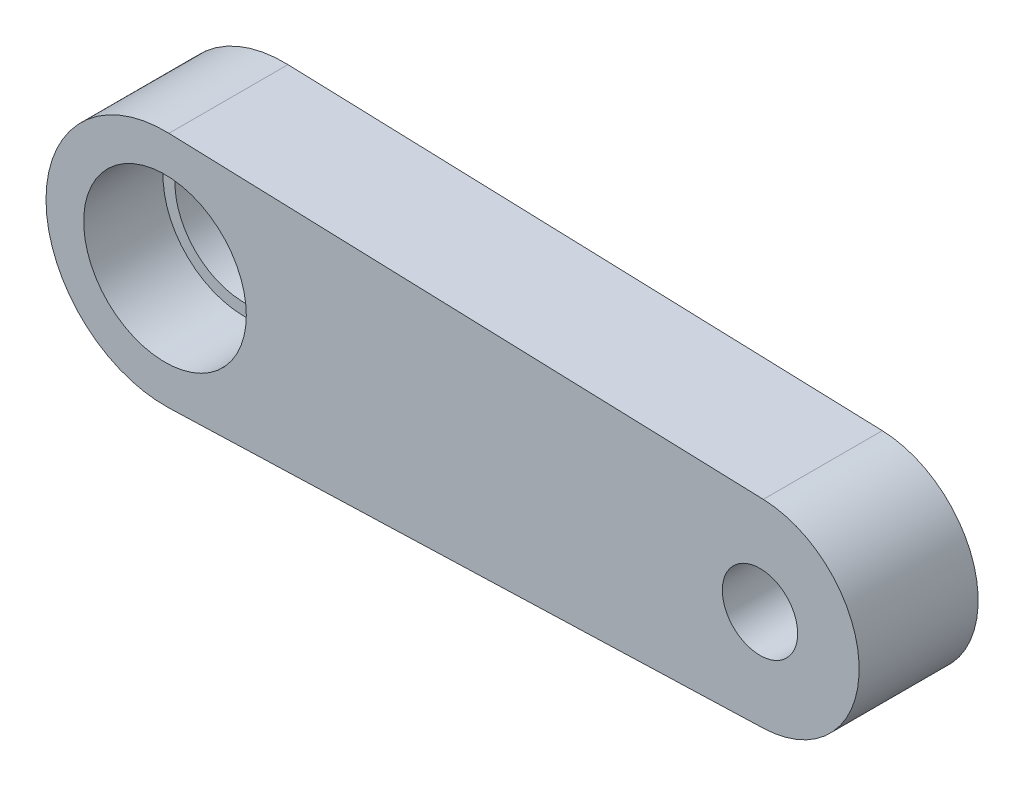
ISO-10303-21;
HEADER;
FILE_DESCRIPTION(('STEP AP214'),'2;1');
FILE_NAME('part.step','',(''),(''),'','','');
FILE_SCHEMA(('AUTOMOTIVE_DESIGN { 1 0 10303 214 1 1 1 1 }'));
ENDSEC;
DATA;
#1=APPLICATION_CONTEXT('core data for automotive mechanical design processes');
#2=APPLICATION_PROTOCOL_DEFINITION('international standard','automotive_design',2000,#1);
#3=PRODUCT_CONTEXT('',#1,'mechanical');
#4=PRODUCT('Part','Part','',(#3));
#5=PRODUCT_RELATED_PRODUCT_CATEGORY('part','',(#4));
#6=PRODUCT_DEFINITION_FORMATION('','',#4);
#7=PRODUCT_DEFINITION_CONTEXT('part definition',#1,'design');
#8=PRODUCT_DEFINITION('design','',#6,#7);
#9=PRODUCT_DEFINITION_SHAPE('','',#8);
#10=(LENGTH_UNIT() NAMED_UNIT(*) SI_UNIT(.MILLI.,.METRE.));
#11=(NAMED_UNIT(*) PLANE_ANGLE_UNIT() SI_UNIT($,.RADIAN.));
#12=(NAMED_UNIT(*) SI_UNIT($,.STERADIAN.) SOLID_ANGLE_UNIT());
#13=UNCERTAINTY_MEASURE_WITH_UNIT(LENGTH_MEASURE(1.E-05),#10,'distance_accuracy_value','');
#14=(GEOMETRIC_REPRESENTATION_CONTEXT(3) GLOBAL_UNCERTAINTY_ASSIGNED_CONTEXT((#13)) GLOBAL_UNIT_ASSIGNED_CONTEXT((#10,
#11,#12)) REPRESENTATION_CONTEXT('',''));
#15=CARTESIAN_POINT('',(0.,0.,0.));
#16=DIRECTION('',(0.,0.,1.));
#17=DIRECTION('',(1.,0.,0.));
#18=AXIS2_PLACEMENT_3D('',#15,#16,#17);
#19=CARTESIAN_POINT('',(0.,0.,6.));
#20=DIRECTION('',(0.,0.,-1.));
#21=DIRECTION('',(-1.,0.,0.));
#22=AXIS2_PLACEMENT_3D('',#19,#20,#21);
#23=CYLINDRICAL_SURFACE('',#22,5.);
#24=CARTESIAN_POINT('',(0.,0.,0.));
#25=DIRECTION('',(0.,0.,1.));
#26=DIRECTION('',(-1.,0.,0.));
#27=AXIS2_PLACEMENT_3D('',#24,#25,#26);
#28=CIRCLE('',#27,5.);
#29=CARTESIAN_POINT('',(0.166666666666667,-4.99722145018832,0.));
#30=VERTEX_POINT('',#29);
#31=CARTESIAN_POINT('',(0.166666666666667,4.99722145018832,0.));
#32=VERTEX_POINT('',#31);
#33=EDGE_CURVE('E105',#30,#32,#28,.T.);
#34=ORIENTED_EDGE('',*,*,#33,.T.);
#35=DIRECTION('',(0.,0.,-1.));
#36=VECTOR('',#35,1.);
#37=CARTESIAN_POINT('',(0.166666666666667,4.99722145018832,6.));
#38=LINE('',#37,#36);
#39=CARTESIAN_POINT('',(0.166666666666667,4.99722145018832,6.));
#40=VERTEX_POINT('',#39);
#41=EDGE_CURVE('E11',#40,#32,#38,.T.);
#42=ORIENTED_EDGE('',*,*,#41,.F.);
#43=CARTESIAN_POINT('',(0.,0.,6.));
#44=DIRECTION('',(0.,0.,1.));
#45=DIRECTION('',(-1.,0.,0.));
#46=AXIS2_PLACEMENT_3D('',#43,#44,#45);
#47=CIRCLE('',#46,5.);
#48=CARTESIAN_POINT('',(0.166666666666667,-4.99722145018832,6.));
#49=VERTEX_POINT('',#48);
#50=EDGE_CURVE('E92',#49,#40,#47,.T.);
#51=ORIENTED_EDGE('',*,*,#50,.F.);
#52=DIRECTION('',(0.,0.,-1.));
#53=VECTOR('',#52,1.);
#54=CARTESIAN_POINT('',(0.166666666666667,-4.99722145018832,6.));
#55=LINE('',#54,#53);
#56=EDGE_CURVE('E101',#49,#30,#55,.T.);
#57=ORIENTED_EDGE('',*,*,#56,.T.);
#58=EDGE_LOOP('',(#34,#42,#51,#57));
#59=FACE_BOUND('',#58,.T.);
#60=ADVANCED_FACE('F39',(#59),#23,.T.);
#61=CARTESIAN_POINT('',(0.166666666666667,4.99722145018832,6.));
#62=DIRECTION('',(-0.0333333333333333,-0.999444290037663,0.));
#63=DIRECTION('',(0.999444290037663,-0.0333333333333333,0.));
#64=AXIS2_PLACEMENT_3D('',#61,#62,#63);
#65=PLANE('',#64);
#66=DIRECTION('',(-0.999444290037663,0.0333333333333333,0.));
#67=VECTOR('',#66,1.);
#68=CARTESIAN_POINT('',(0.166666666666667,4.99722145018832,0.));
#69=LINE('',#68,#67);
#70=CARTESIAN_POINT('',(-29.8,5.99666574022598,0.));
#71=VERTEX_POINT('',#70);
#72=EDGE_CURVE('E96',#32,#71,#69,.T.);
#73=ORIENTED_EDGE('',*,*,#72,.T.);
#74=DIRECTION('',(0.,0.,-1.));
#75=VECTOR('',#74,1.);
#76=CARTESIAN_POINT('',(-29.8,5.99666574022598,6.));
#77=LINE('',#76,#75);
#78=CARTESIAN_POINT('',(-29.8,5.99666574022598,6.));
#79=VERTEX_POINT('',#78);
#80=EDGE_CURVE('E48',#79,#71,#77,.T.);
#81=ORIENTED_EDGE('',*,*,#80,.F.);
#82=DIRECTION('',(-0.999444290037663,0.0333333333333333,0.));
#83=VECTOR('',#82,1.);
#84=CARTESIAN_POINT('',(0.166666666666667,4.99722145018832,6.));
#85=LINE('',#84,#83);
#86=EDGE_CURVE('E87',#40,#79,#85,.T.);
#87=ORIENTED_EDGE('',*,*,#86,.F.);
#88=ORIENTED_EDGE('',*,*,#41,.T.);
#89=EDGE_LOOP('',(#73,#81,#87,#88));
#90=FACE_BOUND('',#89,.T.);
#91=ADVANCED_FACE('F95',(#90),#65,.F.);
#92=CARTESIAN_POINT('',(-30.,0.,6.));
#93=DIRECTION('',(0.,0.,-1.));
#94=DIRECTION('',(-1.,0.,0.));
#95=AXIS2_PLACEMENT_3D('',#92,#93,#94);
#96=CYLINDRICAL_SURFACE('',#95,6.);
#97=CARTESIAN_POINT('',(-30.,0.,0.));
#98=DIRECTION('',(0.,0.,1.));
#99=DIRECTION('',(1.,0.,0.));
#100=AXIS2_PLACEMENT_3D('',#97,#98,#99);
#101=CIRCLE('',#100,6.);
#102=CARTESIAN_POINT('',(-29.8,-5.99666574022598,0.));
#103=VERTEX_POINT('',#102);
#104=EDGE_CURVE('E74',#71,#103,#101,.T.);
#105=ORIENTED_EDGE('',*,*,#104,.T.);
#106=DIRECTION('',(0.,0.,-1.));
#107=VECTOR('',#106,1.);
#108=CARTESIAN_POINT('',(-29.8,-5.99666574022598,6.));
#109=LINE('',#108,#107);
#110=CARTESIAN_POINT('',(-29.8,-5.99666574022598,6.));
#111=VERTEX_POINT('',#110);
#112=EDGE_CURVE('E97',#111,#103,#109,.T.);
#113=ORIENTED_EDGE('',*,*,#112,.F.);
#114=CARTESIAN_POINT('',(-30.,0.,6.));
#115=DIRECTION('',(0.,0.,1.));
#116=DIRECTION('',(1.,0.,0.));
#117=AXIS2_PLACEMENT_3D('',#114,#115,#116);
#118=CIRCLE('',#117,6.);
#119=EDGE_CURVE('E90',#79,#111,#118,.T.);
#120=ORIENTED_EDGE('',*,*,#119,.F.);
#121=ORIENTED_EDGE('',*,*,#80,.T.);
#122=EDGE_LOOP('',(#105,#113,#120,#121));
#123=FACE_BOUND('',#122,.T.);
#124=ADVANCED_FACE('F99',(#123),#96,.T.);
#125=CARTESIAN_POINT('',(0.166666666666667,-4.99722145018832,6.));
#126=DIRECTION('',(-0.0333333333333334,0.999444290037663,0.));
#127=DIRECTION('',(-0.999444290037663,-0.0333333333333334,0.));
#128=AXIS2_PLACEMENT_3D('',#125,#126,#127);
#129=PLANE('',#128);
#130=DIRECTION('',(0.999444290037663,0.0333333333333334,0.));
#131=VECTOR('',#130,1.);
#132=CARTESIAN_POINT('',(0.166666666666667,-4.99722145018832,0.));
#133=LINE('',#132,#131);
#134=EDGE_CURVE('E80',#103,#30,#133,.T.);
#135=ORIENTED_EDGE('',*,*,#134,.T.);
#136=ORIENTED_EDGE('',*,*,#56,.F.);
#137=DIRECTION('',(0.999444290037663,0.0333333333333334,0.));
#138=VECTOR('',#137,1.);
#139=CARTESIAN_POINT('',(0.166666666666667,-4.99722145018832,6.));
#140=LINE('',#139,#138);
#141=EDGE_CURVE('E57',#111,#49,#140,.T.);
#142=ORIENTED_EDGE('',*,*,#141,.F.);
#143=ORIENTED_EDGE('',*,*,#112,.T.);
#144=EDGE_LOOP('',(#135,#136,#142,#143));
#145=FACE_BOUND('',#144,.T.);
#146=ADVANCED_FACE('F146',(#145),#129,.F.);
#147=CARTESIAN_POINT('',(0.,0.,6.));
#148=DIRECTION('',(0.,0.,-1.));
#149=DIRECTION('',(-1.,0.,0.));
#150=AXIS2_PLACEMENT_3D('',#147,#148,#149);
#151=PLANE('',#150);
#152=CARTESIAN_POINT('',(0.,0.,6.));
#153=DIRECTION('',(0.,0.,-1.));
#154=DIRECTION('',(-1.,0.,0.));
#155=AXIS2_PLACEMENT_3D('',#152,#153,#154);
#156=CIRCLE('',#155,1.9);
#157=CARTESIAN_POINT('',(-1.9,0.,6.));
#158=VERTEX_POINT('',#157);
#159=EDGE_CURVE('E123',#158,#158,#156,.T.);
#160=ORIENTED_EDGE('',*,*,#159,.T.);
#161=EDGE_LOOP('',(#160));
#162=FACE_BOUND('',#161,.T.);
#163=CARTESIAN_POINT('',(-30.,0.,6.));
#164=DIRECTION('',(0.,0.,1.));
#165=DIRECTION('',(1.,0.,0.));
#166=AXIS2_PLACEMENT_3D('',#163,#164,#165);
#167=CIRCLE('',#166,4.1);
#168=CARTESIAN_POINT('',(-25.9,0.,6.));
#169=VERTEX_POINT('',#168);
#170=EDGE_CURVE('E115',#169,#169,#167,.T.);
#171=ORIENTED_EDGE('',*,*,#170,.F.);
#172=EDGE_LOOP('',(#171));
#173=FACE_BOUND('',#172,.T.);
#174=ORIENTED_EDGE('',*,*,#50,.T.);
#175=ORIENTED_EDGE('',*,*,#86,.T.);
#176=ORIENTED_EDGE('',*,*,#119,.T.);
#177=ORIENTED_EDGE('',*,*,#141,.T.);
#178=EDGE_LOOP('',(#174,#175,#176,#177));
#179=FACE_BOUND('',#178,.T.);
#180=ADVANCED_FACE('F88',(#162,#173,#179),#151,.F.);
#181=CARTESIAN_POINT('',(0.,0.,0.));
#182=DIRECTION('',(0.,0.,-1.));
#183=DIRECTION('',(-1.,0.,0.));
#184=AXIS2_PLACEMENT_3D('',#181,#182,#183);
#185=PLANE('',#184);
#186=CARTESIAN_POINT('',(-30.,0.,0.));
#187=DIRECTION('',(0.,0.,1.));
#188=DIRECTION('',(1.,0.,0.));
#189=AXIS2_PLACEMENT_3D('',#186,#187,#188);
#190=CIRCLE('',#189,3.5);
#191=CARTESIAN_POINT('',(-26.5,0.,0.));
#192=VERTEX_POINT('',#191);
#193=EDGE_CURVE('E116',#192,#192,#190,.T.);
#194=ORIENTED_EDGE('',*,*,#193,.T.);
#195=EDGE_LOOP('',(#194));
#196=FACE_BOUND('',#195,.T.);
#197=CARTESIAN_POINT('',(0.,0.,0.));
#198=DIRECTION('',(0.,0.,-1.));
#199=DIRECTION('',(-1.,0.,0.));
#200=AXIS2_PLACEMENT_3D('',#197,#198,#199);
#201=CIRCLE('',#200,4.1);
#202=CARTESIAN_POINT('',(-4.1,0.,0.));
#203=VERTEX_POINT('',#202);
#204=EDGE_CURVE('E131',#203,#203,#201,.T.);
#205=ORIENTED_EDGE('',*,*,#204,.F.);
#206=EDGE_LOOP('',(#205));
#207=FACE_BOUND('',#206,.T.);
#208=ORIENTED_EDGE('',*,*,#33,.F.);
#209=ORIENTED_EDGE('',*,*,#134,.F.);
#210=ORIENTED_EDGE('',*,*,#104,.F.);
#211=ORIENTED_EDGE('',*,*,#72,.F.);
#212=EDGE_LOOP('',(#208,#209,#210,#211));
#213=FACE_BOUND('',#212,.T.);
#214=ADVANCED_FACE('F140',(#196,#207,#213),#185,.T.);
#215=CARTESIAN_POINT('',(0.,0.,1.2));
#216=DIRECTION('',(0.,0.,-1.));
#217=DIRECTION('',(-1.,0.,0.));
#218=AXIS2_PLACEMENT_3D('',#215,#216,#217);
#219=CYLINDRICAL_SURFACE('',#218,4.1);
#220=CARTESIAN_POINT('',(0.,0.,1.2));
#221=DIRECTION('',(0.,0.,-1.));
#222=DIRECTION('',(-1.,0.,0.));
#223=AXIS2_PLACEMENT_3D('',#220,#221,#222);
#224=CIRCLE('',#223,4.1);
#225=CARTESIAN_POINT('',(-4.1,0.,1.2));
#226=VERTEX_POINT('',#225);
#227=EDGE_CURVE('E108',#226,#226,#224,.T.);
#228=ORIENTED_EDGE('',*,*,#227,.F.);
#229=EDGE_LOOP('',(#228));
#230=FACE_BOUND('',#229,.T.);
#231=ORIENTED_EDGE('',*,*,#204,.T.);
#232=EDGE_LOOP('',(#231));
#233=FACE_BOUND('',#232,.T.);
#234=ADVANCED_FACE('F138',(#230,#233),#219,.F.);
#235=CARTESIAN_POINT('',(0.,0.,1.2));
#236=DIRECTION('',(0.,0.,-1.));
#237=DIRECTION('',(-1.,0.,0.));
#238=AXIS2_PLACEMENT_3D('',#235,#236,#237);
#239=PLANE('',#238);
#240=CARTESIAN_POINT('',(0.,0.,1.2));
#241=DIRECTION('',(0.,0.,-1.));
#242=DIRECTION('',(-1.,0.,0.));
#243=AXIS2_PLACEMENT_3D('',#240,#241,#242);
#244=CIRCLE('',#243,1.9);
#245=CARTESIAN_POINT('',(-1.9,0.,1.2));
#246=VERTEX_POINT('',#245);
#247=EDGE_CURVE('E42',#246,#246,#244,.T.);
#248=ORIENTED_EDGE('',*,*,#247,.F.);
#249=EDGE_LOOP('',(#248));
#250=FACE_BOUND('',#249,.T.);
#251=ORIENTED_EDGE('',*,*,#227,.T.);
#252=EDGE_LOOP('',(#251));
#253=FACE_BOUND('',#252,.T.);
#254=ADVANCED_FACE('F182',(#250,#253),#239,.T.);
#255=CARTESIAN_POINT('',(-30.,0.,2.));
#256=DIRECTION('',(0.,0.,1.));
#257=DIRECTION('',(1.,0.,0.));
#258=AXIS2_PLACEMENT_3D('',#255,#256,#257);
#259=CYLINDRICAL_SURFACE('',#258,4.1);
#260=CARTESIAN_POINT('',(-30.,0.,2.));
#261=DIRECTION('',(0.,0.,1.));
#262=DIRECTION('',(1.,0.,0.));
#263=AXIS2_PLACEMENT_3D('',#260,#261,#262);
#264=CIRCLE('',#263,4.1);
#265=CARTESIAN_POINT('',(-25.9,0.,2.));
#266=VERTEX_POINT('',#265);
#267=EDGE_CURVE('E120',#266,#266,#264,.T.);
#268=ORIENTED_EDGE('',*,*,#267,.F.);
#269=EDGE_LOOP('',(#268));
#270=FACE_BOUND('',#269,.T.);
#271=ORIENTED_EDGE('',*,*,#170,.T.);
#272=EDGE_LOOP('',(#271));
#273=FACE_BOUND('',#272,.T.);
#274=ADVANCED_FACE('F192',(#270,#273),#259,.F.);
#275=CARTESIAN_POINT('',(-30.,0.,2.));
#276=DIRECTION('',(0.,0.,1.));
#277=DIRECTION('',(1.,0.,0.));
#278=AXIS2_PLACEMENT_3D('',#275,#276,#277);
#279=PLANE('',#278);
#280=CARTESIAN_POINT('',(-30.,0.,2.));
#281=DIRECTION('',(0.,0.,1.));
#282=DIRECTION('',(1.,0.,0.));
#283=AXIS2_PLACEMENT_3D('',#280,#281,#282);
#284=CIRCLE('',#283,3.5);
#285=CARTESIAN_POINT('',(-26.5,0.,2.));
#286=VERTEX_POINT('',#285);
#287=EDGE_CURVE('E113',#286,#286,#284,.T.);
#288=ORIENTED_EDGE('',*,*,#287,.F.);
#289=EDGE_LOOP('',(#288));
#290=FACE_BOUND('',#289,.T.);
#291=ORIENTED_EDGE('',*,*,#267,.T.);
#292=EDGE_LOOP('',(#291));
#293=FACE_BOUND('',#292,.T.);
#294=ADVANCED_FACE('F197',(#290,#293),#279,.T.);
#295=CARTESIAN_POINT('',(-30.,0.,0.));
#296=DIRECTION('',(0.,0.,1.));
#297=DIRECTION('',(1.,0.,0.));
#298=AXIS2_PLACEMENT_3D('',#295,#296,#297);
#299=CYLINDRICAL_SURFACE('',#298,3.5);
#300=ORIENTED_EDGE('',*,*,#287,.T.);
#301=EDGE_LOOP('',(#300));
#302=FACE_BOUND('',#301,.T.);
#303=ORIENTED_EDGE('',*,*,#193,.F.);
#304=EDGE_LOOP('',(#303));
#305=FACE_BOUND('',#304,.T.);
#306=ADVANCED_FACE('F214',(#302,#305),#299,.F.);
#307=CARTESIAN_POINT('',(0.,0.,0.));
#308=DIRECTION('',(0.,0.,1.));
#309=DIRECTION('',(1.,0.,0.));
#310=AXIS2_PLACEMENT_3D('',#307,#308,#309);
#311=CYLINDRICAL_SURFACE('',#310,1.9);
#312=ORIENTED_EDGE('',*,*,#247,.T.);
#313=EDGE_LOOP('',(#312));
#314=FACE_BOUND('',#313,.T.);
#315=ORIENTED_EDGE('',*,*,#159,.F.);
#316=EDGE_LOOP('',(#315));
#317=FACE_BOUND('',#316,.T.);
#318=ADVANCED_FACE('F225',(#314,#317),#311,.F.);
#319=CLOSED_SHELL('',(#60,#91,#124,#146,#180,#214,#234,#254,#274,#294,#306,#318));
#320=MANIFOLD_SOLID_BREP('B2',#319);
#321=ADVANCED_BREP_SHAPE_REPRESENTATION('',(#18,#320),#14);
#322=SHAPE_DEFINITION_REPRESENTATION(#9,#321);
ENDSEC;
END-ISO-10303-21;
